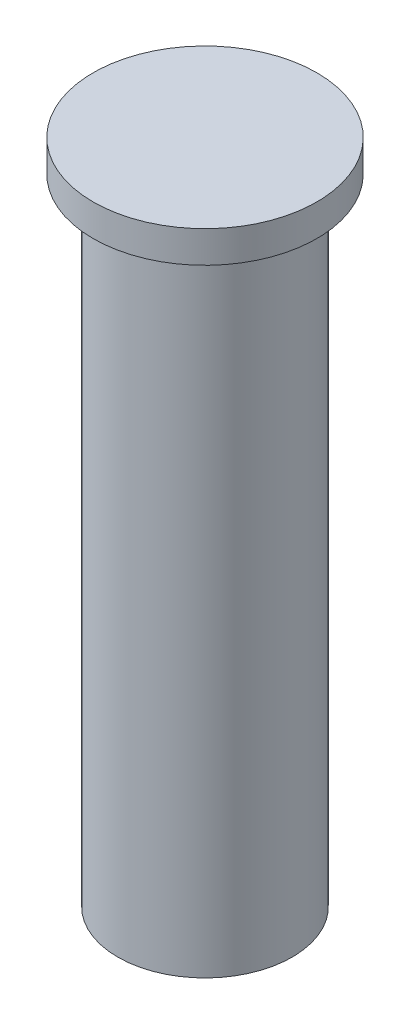
ISO-10303-21;
HEADER;
FILE_DESCRIPTION(('STEP AP214'),'2;1');
FILE_NAME('part.step','',(''),(''),'','','');
FILE_SCHEMA(('AUTOMOTIVE_DESIGN { 1 0 10303 214 1 1 1 1 }'));
ENDSEC;
DATA;
#1=APPLICATION_CONTEXT('core data for automotive mechanical design processes');
#2=APPLICATION_PROTOCOL_DEFINITION('international standard','automotive_design',2000,#1);
#3=PRODUCT_CONTEXT('',#1,'mechanical');
#4=PRODUCT('Part','Part','',(#3));
#5=PRODUCT_RELATED_PRODUCT_CATEGORY('part','',(#4));
#6=PRODUCT_DEFINITION_FORMATION('','',#4);
#7=PRODUCT_DEFINITION_CONTEXT('part definition',#1,'design');
#8=PRODUCT_DEFINITION('design','',#6,#7);
#9=PRODUCT_DEFINITION_SHAPE('','',#8);
#10=(LENGTH_UNIT() NAMED_UNIT(*) SI_UNIT(.MILLI.,.METRE.));
#11=(NAMED_UNIT(*) PLANE_ANGLE_UNIT() SI_UNIT($,.RADIAN.));
#12=(NAMED_UNIT(*) SI_UNIT($,.STERADIAN.) SOLID_ANGLE_UNIT());
#13=UNCERTAINTY_MEASURE_WITH_UNIT(LENGTH_MEASURE(1.E-05),#10,'distance_accuracy_value','');
#14=(GEOMETRIC_REPRESENTATION_CONTEXT(3) GLOBAL_UNCERTAINTY_ASSIGNED_CONTEXT((#13)) GLOBAL_UNIT_ASSIGNED_CONTEXT((#10,
#11,#12)) REPRESENTATION_CONTEXT('',''));
#15=CARTESIAN_POINT('',(0.,0.,0.));
#16=DIRECTION('',(0.,0.,1.));
#17=DIRECTION('',(1.,0.,0.));
#18=AXIS2_PLACEMENT_3D('',#15,#16,#17);
#19=CARTESIAN_POINT('',(0.,50.8,0.));
#20=DIRECTION('',(0.,-1.,0.));
#21=DIRECTION('',(0.,0.,-1.));
#22=AXIS2_PLACEMENT_3D('',#19,#20,#21);
#23=CYLINDRICAL_SURFACE('',#22,6.985);
#24=CARTESIAN_POINT('',(0.,50.8,0.));
#25=DIRECTION('',(0.,1.,0.));
#26=DIRECTION('',(0.,0.,1.));
#27=AXIS2_PLACEMENT_3D('',#24,#25,#26);
#28=CIRCLE('',#27,6.985);
#29=CARTESIAN_POINT('',(0.,50.8,6.985));
#30=VERTEX_POINT('',#29);
#31=EDGE_CURVE('E10',#30,#30,#28,.T.);
#32=ORIENTED_EDGE('',*,*,#31,.F.);
#33=EDGE_LOOP('',(#32));
#34=FACE_BOUND('',#33,.T.);
#35=CARTESIAN_POINT('',(0.,0.,0.));
#36=DIRECTION('',(0.,1.,0.));
#37=DIRECTION('',(0.,0.,1.));
#38=AXIS2_PLACEMENT_3D('',#35,#36,#37);
#39=CIRCLE('',#38,6.985);
#40=CARTESIAN_POINT('',(0.,0.,6.985));
#41=VERTEX_POINT('',#40);
#42=EDGE_CURVE('E40',#41,#41,#39,.T.);
#43=ORIENTED_EDGE('',*,*,#42,.T.);
#44=EDGE_LOOP('',(#43));
#45=FACE_BOUND('',#44,.T.);
#46=ADVANCED_FACE('F37',(#34,#45),#23,.T.);
#47=CARTESIAN_POINT('',(0.,0.,0.));
#48=DIRECTION('',(0.,1.,0.));
#49=DIRECTION('',(0.,0.,1.));
#50=AXIS2_PLACEMENT_3D('',#47,#48,#49);
#51=PLANE('',#50);
#52=ORIENTED_EDGE('',*,*,#42,.F.);
#53=EDGE_LOOP('',(#52));
#54=FACE_BOUND('',#53,.T.);
#55=ADVANCED_FACE('F64',(#54),#51,.F.);
#56=CARTESIAN_POINT('',(0.,53.34,0.));
#57=DIRECTION('',(0.,-1.,0.));
#58=DIRECTION('',(0.,0.,-1.));
#59=AXIS2_PLACEMENT_3D('',#56,#57,#58);
#60=CYLINDRICAL_SURFACE('',#59,8.95691472582998);
#61=CARTESIAN_POINT('',(0.,53.34,0.));
#62=DIRECTION('',(0.,1.,0.));
#63=DIRECTION('',(0.,0.,1.));
#64=AXIS2_PLACEMENT_3D('',#61,#62,#63);
#65=CIRCLE('',#64,8.95691472582998);
#66=CARTESIAN_POINT('',(0.,53.34,8.95691472582998));
#67=VERTEX_POINT('',#66);
#68=EDGE_CURVE('E49',#67,#67,#65,.T.);
#69=ORIENTED_EDGE('',*,*,#68,.F.);
#70=EDGE_LOOP('',(#69));
#71=FACE_BOUND('',#70,.T.);
#72=CARTESIAN_POINT('',(0.,50.8,0.));
#73=DIRECTION('',(0.,1.,0.));
#74=DIRECTION('',(0.,0.,1.));
#75=AXIS2_PLACEMENT_3D('',#72,#73,#74);
#76=CIRCLE('',#75,8.95691472582998);
#77=CARTESIAN_POINT('',(0.,50.8,8.95691472582998));
#78=VERTEX_POINT('',#77);
#79=EDGE_CURVE('E51',#78,#78,#76,.T.);
#80=ORIENTED_EDGE('',*,*,#79,.T.);
#81=EDGE_LOOP('',(#80));
#82=FACE_BOUND('',#81,.T.);
#83=ADVANCED_FACE('F61',(#71,#82),#60,.T.);
#84=CARTESIAN_POINT('',(0.,53.34,0.));
#85=DIRECTION('',(0.,1.,0.));
#86=DIRECTION('',(0.,0.,1.));
#87=AXIS2_PLACEMENT_3D('',#84,#85,#86);
#88=PLANE('',#87);
#89=ORIENTED_EDGE('',*,*,#68,.T.);
#90=EDGE_LOOP('',(#89));
#91=FACE_BOUND('',#90,.T.);
#92=ADVANCED_FACE('F59',(#91),#88,.T.);
#93=CARTESIAN_POINT('',(0.,50.8,0.));
#94=DIRECTION('',(0.,1.,0.));
#95=DIRECTION('',(0.,0.,1.));
#96=AXIS2_PLACEMENT_3D('',#93,#94,#95);
#97=PLANE('',#96);
#98=ORIENTED_EDGE('',*,*,#31,.T.);
#99=EDGE_LOOP('',(#98));
#100=FACE_BOUND('',#99,.T.);
#101=ORIENTED_EDGE('',*,*,#79,.F.);
#102=EDGE_LOOP('',(#101));
#103=FACE_BOUND('',#102,.T.);
#104=ADVANCED_FACE('F68',(#100,#103),#97,.F.);
#105=CLOSED_SHELL('',(#46,#55,#83,#92,#104));
#106=MANIFOLD_SOLID_BREP('B2',#105);
#107=ADVANCED_BREP_SHAPE_REPRESENTATION('',(#18,#106),#14);
#108=SHAPE_DEFINITION_REPRESENTATION(#9,#107);
ENDSEC;
END-ISO-10303-21;
